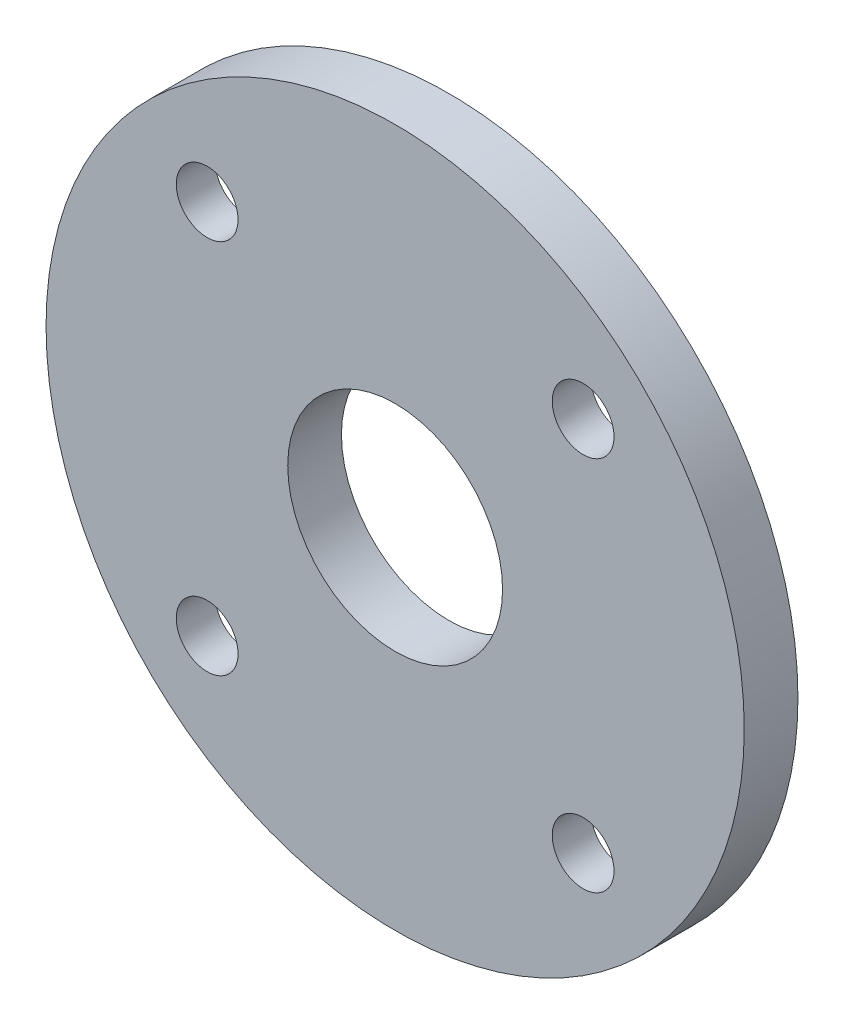
ISO-10303-21;
HEADER;
FILE_DESCRIPTION(('STEP AP214'),'2;1');
FILE_NAME('part.step','',(''),(''),'','','');
FILE_SCHEMA(('AUTOMOTIVE_DESIGN { 1 0 10303 214 1 1 1 1 }'));
ENDSEC;
DATA;
#1=APPLICATION_CONTEXT('core data for automotive mechanical design processes');
#2=APPLICATION_PROTOCOL_DEFINITION('international standard','automotive_design',2000,#1);
#3=PRODUCT_CONTEXT('',#1,'mechanical');
#4=PRODUCT('Part','Part','',(#3));
#5=PRODUCT_RELATED_PRODUCT_CATEGORY('part','',(#4));
#6=PRODUCT_DEFINITION_FORMATION('','',#4);
#7=PRODUCT_DEFINITION_CONTEXT('part definition',#1,'design');
#8=PRODUCT_DEFINITION('design','',#6,#7);
#9=PRODUCT_DEFINITION_SHAPE('','',#8);
#10=(LENGTH_UNIT() NAMED_UNIT(*) SI_UNIT(.MILLI.,.METRE.));
#11=(NAMED_UNIT(*) PLANE_ANGLE_UNIT() SI_UNIT($,.RADIAN.));
#12=(NAMED_UNIT(*) SI_UNIT($,.STERADIAN.) SOLID_ANGLE_UNIT());
#13=UNCERTAINTY_MEASURE_WITH_UNIT(LENGTH_MEASURE(1.E-05),#10,'distance_accuracy_value','');
#14=(GEOMETRIC_REPRESENTATION_CONTEXT(3) GLOBAL_UNCERTAINTY_ASSIGNED_CONTEXT((#13)) GLOBAL_UNIT_ASSIGNED_CONTEXT((#10,
#11,#12)) REPRESENTATION_CONTEXT('',''));
#15=CARTESIAN_POINT('',(0.,0.,0.));
#16=DIRECTION('',(0.,0.,1.));
#17=DIRECTION('',(1.,0.,0.));
#18=AXIS2_PLACEMENT_3D('',#15,#16,#17);
#19=CARTESIAN_POINT('',(0.,0.,2.));
#20=DIRECTION('',(0.,0.,1.));
#21=DIRECTION('',(1.,0.,0.));
#22=AXIS2_PLACEMENT_3D('',#19,#20,#21);
#23=PLANE('',#22);
#24=CARTESIAN_POINT('',(7.,-7.,2.));
#25=DIRECTION('',(0.,0.,1.));
#26=DIRECTION('',(1.,0.,0.));
#27=AXIS2_PLACEMENT_3D('',#24,#25,#26);
#28=CIRCLE('',#27,1.15);
#29=CARTESIAN_POINT('',(8.15,-7.,2.));
#30=VERTEX_POINT('',#29);
#31=EDGE_CURVE('E72',#30,#30,#28,.T.);
#32=ORIENTED_EDGE('',*,*,#31,.F.);
#33=EDGE_LOOP('',(#32));
#34=FACE_BOUND('',#33,.T.);
#35=CARTESIAN_POINT('',(-7.,-7.,2.));
#36=DIRECTION('',(0.,0.,1.));
#37=DIRECTION('',(1.,0.,0.));
#38=AXIS2_PLACEMENT_3D('',#35,#36,#37);
#39=CIRCLE('',#38,1.15);
#40=CARTESIAN_POINT('',(-5.85,-7.,2.));
#41=VERTEX_POINT('',#40);
#42=EDGE_CURVE('E73',#41,#41,#39,.T.);
#43=ORIENTED_EDGE('',*,*,#42,.F.);
#44=EDGE_LOOP('',(#43));
#45=FACE_BOUND('',#44,.T.);
#46=CARTESIAN_POINT('',(-7.,7.,2.));
#47=DIRECTION('',(0.,0.,1.));
#48=DIRECTION('',(1.,0.,0.));
#49=AXIS2_PLACEMENT_3D('',#46,#47,#48);
#50=CIRCLE('',#49,1.15);
#51=CARTESIAN_POINT('',(-5.85,7.,2.));
#52=VERTEX_POINT('',#51);
#53=EDGE_CURVE('E78',#52,#52,#50,.T.);
#54=ORIENTED_EDGE('',*,*,#53,.F.);
#55=EDGE_LOOP('',(#54));
#56=FACE_BOUND('',#55,.T.);
#57=CARTESIAN_POINT('',(7.,7.,2.));
#58=DIRECTION('',(0.,0.,1.));
#59=DIRECTION('',(1.,0.,0.));
#60=AXIS2_PLACEMENT_3D('',#57,#58,#59);
#61=CIRCLE('',#60,1.15);
#62=CARTESIAN_POINT('',(8.15,7.,2.));
#63=VERTEX_POINT('',#62);
#64=EDGE_CURVE('E83',#63,#63,#61,.T.);
#65=ORIENTED_EDGE('',*,*,#64,.F.);
#66=EDGE_LOOP('',(#65));
#67=FACE_BOUND('',#66,.T.);
#68=CARTESIAN_POINT('',(0.,0.,2.));
#69=DIRECTION('',(0.,0.,1.));
#70=DIRECTION('',(1.,0.,0.));
#71=AXIS2_PLACEMENT_3D('',#68,#69,#70);
#72=CIRCLE('',#71,13.);
#73=CARTESIAN_POINT('',(13.,0.,2.));
#74=VERTEX_POINT('',#73);
#75=EDGE_CURVE('E10',#74,#74,#72,.T.);
#76=ORIENTED_EDGE('',*,*,#75,.T.);
#77=EDGE_LOOP('',(#76));
#78=FACE_BOUND('',#77,.T.);
#79=CARTESIAN_POINT('',(0.,0.,2.));
#80=DIRECTION('',(0.,0.,1.));
#81=DIRECTION('',(1.,0.,0.));
#82=AXIS2_PLACEMENT_3D('',#79,#80,#81);
#83=CIRCLE('',#82,4.);
#84=CARTESIAN_POINT('',(4.,0.,2.));
#85=VERTEX_POINT('',#84);
#86=EDGE_CURVE('E53',#85,#85,#83,.T.);
#87=ORIENTED_EDGE('',*,*,#86,.F.);
#88=EDGE_LOOP('',(#87));
#89=FACE_BOUND('',#88,.T.);
#90=ADVANCED_FACE('F41',(#34,#45,#56,#67,#78,#89),#23,.T.);
#91=CARTESIAN_POINT('',(0.,0.,0.));
#92=DIRECTION('',(0.,0.,1.));
#93=DIRECTION('',(1.,0.,0.));
#94=AXIS2_PLACEMENT_3D('',#91,#92,#93);
#95=PLANE('',#94);
#96=CARTESIAN_POINT('',(7.,-7.,0.));
#97=DIRECTION('',(0.,0.,1.));
#98=DIRECTION('',(1.,0.,0.));
#99=AXIS2_PLACEMENT_3D('',#96,#97,#98);
#100=CIRCLE('',#99,2.1);
#101=CARTESIAN_POINT('',(9.1,-7.,0.));
#102=VERTEX_POINT('',#101);
#103=EDGE_CURVE('E134',#102,#102,#100,.T.);
#104=ORIENTED_EDGE('',*,*,#103,.T.);
#105=EDGE_LOOP('',(#104));
#106=FACE_BOUND('',#105,.T.);
#107=CARTESIAN_POINT('',(-7.,-7.,0.));
#108=DIRECTION('',(0.,0.,1.));
#109=DIRECTION('',(1.,0.,0.));
#110=AXIS2_PLACEMENT_3D('',#107,#108,#109);
#111=CIRCLE('',#110,2.1);
#112=CARTESIAN_POINT('',(-4.9,-7.,0.));
#113=VERTEX_POINT('',#112);
#114=EDGE_CURVE('E138',#113,#113,#111,.T.);
#115=ORIENTED_EDGE('',*,*,#114,.T.);
#116=EDGE_LOOP('',(#115));
#117=FACE_BOUND('',#116,.T.);
#118=CARTESIAN_POINT('',(-7.,7.,0.));
#119=DIRECTION('',(0.,0.,1.));
#120=DIRECTION('',(1.,0.,0.));
#121=AXIS2_PLACEMENT_3D('',#118,#119,#120);
#122=CIRCLE('',#121,2.1);
#123=CARTESIAN_POINT('',(-4.9,7.,0.));
#124=VERTEX_POINT('',#123);
#125=EDGE_CURVE('E130',#124,#124,#122,.T.);
#126=ORIENTED_EDGE('',*,*,#125,.T.);
#127=EDGE_LOOP('',(#126));
#128=FACE_BOUND('',#127,.T.);
#129=CARTESIAN_POINT('',(7.,7.,0.));
#130=DIRECTION('',(0.,0.,1.));
#131=DIRECTION('',(1.,0.,0.));
#132=AXIS2_PLACEMENT_3D('',#129,#130,#131);
#133=CIRCLE('',#132,2.1);
#134=CARTESIAN_POINT('',(9.1,7.,0.));
#135=VERTEX_POINT('',#134);
#136=EDGE_CURVE('E123',#135,#135,#133,.T.);
#137=ORIENTED_EDGE('',*,*,#136,.T.);
#138=EDGE_LOOP('',(#137));
#139=FACE_BOUND('',#138,.T.);
#140=CARTESIAN_POINT('',(0.,0.,0.));
#141=DIRECTION('',(0.,0.,1.));
#142=DIRECTION('',(1.,0.,0.));
#143=AXIS2_PLACEMENT_3D('',#140,#141,#142);
#144=CIRCLE('',#143,13.);
#145=CARTESIAN_POINT('',(13.,0.,0.));
#146=VERTEX_POINT('',#145);
#147=EDGE_CURVE('E47',#146,#146,#144,.T.);
#148=ORIENTED_EDGE('',*,*,#147,.F.);
#149=EDGE_LOOP('',(#148));
#150=FACE_BOUND('',#149,.T.);
#151=CARTESIAN_POINT('',(0.,0.,0.));
#152=DIRECTION('',(0.,0.,1.));
#153=DIRECTION('',(1.,0.,0.));
#154=AXIS2_PLACEMENT_3D('',#151,#152,#153);
#155=CIRCLE('',#154,4.);
#156=CARTESIAN_POINT('',(4.,0.,0.));
#157=VERTEX_POINT('',#156);
#158=EDGE_CURVE('E60',#157,#157,#155,.T.);
#159=ORIENTED_EDGE('',*,*,#158,.T.);
#160=EDGE_LOOP('',(#159));
#161=FACE_BOUND('',#160,.T.);
#162=ADVANCED_FACE('F95',(#106,#117,#128,#139,#150,#161),#95,.F.);
#163=CARTESIAN_POINT('',(0.,0.,2.));
#164=DIRECTION('',(0.,0.,-1.));
#165=DIRECTION('',(-1.,0.,0.));
#166=AXIS2_PLACEMENT_3D('',#163,#164,#165);
#167=CYLINDRICAL_SURFACE('',#166,13.);
#168=ORIENTED_EDGE('',*,*,#75,.F.);
#169=EDGE_LOOP('',(#168));
#170=FACE_BOUND('',#169,.T.);
#171=ORIENTED_EDGE('',*,*,#147,.T.);
#172=EDGE_LOOP('',(#171));
#173=FACE_BOUND('',#172,.T.);
#174=ADVANCED_FACE('F43',(#170,#173),#167,.T.);
#175=CARTESIAN_POINT('',(0.,0.,2.));
#176=DIRECTION('',(0.,0.,-1.));
#177=DIRECTION('',(-1.,0.,0.));
#178=AXIS2_PLACEMENT_3D('',#175,#176,#177);
#179=CYLINDRICAL_SURFACE('',#178,4.);
#180=ORIENTED_EDGE('',*,*,#86,.T.);
#181=EDGE_LOOP('',(#180));
#182=FACE_BOUND('',#181,.T.);
#183=ORIENTED_EDGE('',*,*,#158,.F.);
#184=EDGE_LOOP('',(#183));
#185=FACE_BOUND('',#184,.T.);
#186=ADVANCED_FACE('F94',(#182,#185),#179,.F.);
#187=CARTESIAN_POINT('',(7.,7.,2.));
#188=DIRECTION('',(0.,0.,-1.));
#189=DIRECTION('',(-1.,0.,0.));
#190=AXIS2_PLACEMENT_3D('',#187,#188,#189);
#191=CYLINDRICAL_SURFACE('',#190,1.15);
#192=CARTESIAN_POINT('',(7.,7.,0.55));
#193=DIRECTION('',(0.,0.,1.));
#194=DIRECTION('',(1.,0.,0.));
#195=AXIS2_PLACEMENT_3D('',#192,#193,#194);
#196=CIRCLE('',#195,1.15);
#197=CARTESIAN_POINT('',(8.15,7.,0.55));
#198=VERTEX_POINT('',#197);
#199=EDGE_CURVE('E44',#198,#198,#196,.T.);
#200=ORIENTED_EDGE('',*,*,#199,.F.);
#201=EDGE_LOOP('',(#200));
#202=FACE_BOUND('',#201,.T.);
#203=ORIENTED_EDGE('',*,*,#64,.T.);
#204=EDGE_LOOP('',(#203));
#205=FACE_BOUND('',#204,.T.);
#206=ADVANCED_FACE('F96',(#202,#205),#191,.F.);
#207=CARTESIAN_POINT('',(-7.,7.,2.));
#208=DIRECTION('',(0.,0.,-1.));
#209=DIRECTION('',(-1.,0.,0.));
#210=AXIS2_PLACEMENT_3D('',#207,#208,#209);
#211=CYLINDRICAL_SURFACE('',#210,1.15);
#212=CARTESIAN_POINT('',(-7.,7.,0.55));
#213=DIRECTION('',(0.,0.,1.));
#214=DIRECTION('',(1.,0.,0.));
#215=AXIS2_PLACEMENT_3D('',#212,#213,#214);
#216=CIRCLE('',#215,1.15);
#217=CARTESIAN_POINT('',(-5.85,7.,0.55));
#218=VERTEX_POINT('',#217);
#219=EDGE_CURVE('E66',#218,#218,#216,.T.);
#220=ORIENTED_EDGE('',*,*,#219,.F.);
#221=EDGE_LOOP('',(#220));
#222=FACE_BOUND('',#221,.T.);
#223=ORIENTED_EDGE('',*,*,#53,.T.);
#224=EDGE_LOOP('',(#223));
#225=FACE_BOUND('',#224,.T.);
#226=ADVANCED_FACE('F103',(#222,#225),#211,.F.);
#227=CARTESIAN_POINT('',(-7.,-7.,2.));
#228=DIRECTION('',(0.,0.,-1.));
#229=DIRECTION('',(-1.,0.,0.));
#230=AXIS2_PLACEMENT_3D('',#227,#228,#229);
#231=CYLINDRICAL_SURFACE('',#230,1.15);
#232=CARTESIAN_POINT('',(-7.,-7.,0.55));
#233=DIRECTION('',(0.,0.,1.));
#234=DIRECTION('',(1.,0.,0.));
#235=AXIS2_PLACEMENT_3D('',#232,#233,#234);
#236=CIRCLE('',#235,1.15);
#237=CARTESIAN_POINT('',(-5.85,-7.,0.55));
#238=VERTEX_POINT('',#237);
#239=EDGE_CURVE('E64',#238,#238,#236,.T.);
#240=ORIENTED_EDGE('',*,*,#239,.F.);
#241=EDGE_LOOP('',(#240));
#242=FACE_BOUND('',#241,.T.);
#243=ORIENTED_EDGE('',*,*,#42,.T.);
#244=EDGE_LOOP('',(#243));
#245=FACE_BOUND('',#244,.T.);
#246=ADVANCED_FACE('F187',(#242,#245),#231,.F.);
#247=CARTESIAN_POINT('',(7.,-7.,2.));
#248=DIRECTION('',(0.,0.,-1.));
#249=DIRECTION('',(-1.,0.,0.));
#250=AXIS2_PLACEMENT_3D('',#247,#248,#249);
#251=CYLINDRICAL_SURFACE('',#250,1.15);
#252=CARTESIAN_POINT('',(7.,-7.,0.55));
#253=DIRECTION('',(0.,0.,1.));
#254=DIRECTION('',(1.,0.,0.));
#255=AXIS2_PLACEMENT_3D('',#252,#253,#254);
#256=CIRCLE('',#255,1.15);
#257=CARTESIAN_POINT('',(8.15,-7.,0.55));
#258=VERTEX_POINT('',#257);
#259=EDGE_CURVE('E58',#258,#258,#256,.T.);
#260=ORIENTED_EDGE('',*,*,#259,.F.);
#261=EDGE_LOOP('',(#260));
#262=FACE_BOUND('',#261,.T.);
#263=ORIENTED_EDGE('',*,*,#31,.T.);
#264=EDGE_LOOP('',(#263));
#265=FACE_BOUND('',#264,.T.);
#266=ADVANCED_FACE('F174',(#262,#265),#251,.F.);
#267=CARTESIAN_POINT('',(7.,-7.,0.55));
#268=DIRECTION('',(0.,0.,-1.));
#269=DIRECTION('',(-1.,0.,0.));
#270=AXIS2_PLACEMENT_3D('',#267,#268,#269);
#271=CYLINDRICAL_SURFACE('',#270,2.1);
#272=CARTESIAN_POINT('',(7.,-7.,0.55));
#273=DIRECTION('',(0.,0.,1.));
#274=DIRECTION('',(1.,0.,0.));
#275=AXIS2_PLACEMENT_3D('',#272,#273,#274);
#276=CIRCLE('',#275,2.1);
#277=CARTESIAN_POINT('',(9.1,-7.,0.55));
#278=VERTEX_POINT('',#277);
#279=EDGE_CURVE('E128',#278,#278,#276,.T.);
#280=ORIENTED_EDGE('',*,*,#279,.T.);
#281=EDGE_LOOP('',(#280));
#282=FACE_BOUND('',#281,.T.);
#283=ORIENTED_EDGE('',*,*,#103,.F.);
#284=EDGE_LOOP('',(#283));
#285=FACE_BOUND('',#284,.T.);
#286=ADVANCED_FACE('F168',(#282,#285),#271,.F.);
#287=CARTESIAN_POINT('',(7.,-7.,0.55));
#288=DIRECTION('',(0.,0.,1.));
#289=DIRECTION('',(1.,0.,0.));
#290=AXIS2_PLACEMENT_3D('',#287,#288,#289);
#291=PLANE('',#290);
#292=ORIENTED_EDGE('',*,*,#259,.T.);
#293=EDGE_LOOP('',(#292));
#294=FACE_BOUND('',#293,.T.);
#295=ORIENTED_EDGE('',*,*,#279,.F.);
#296=EDGE_LOOP('',(#295));
#297=FACE_BOUND('',#296,.T.);
#298=ADVANCED_FACE('F170',(#294,#297),#291,.F.);
#299=CARTESIAN_POINT('',(-7.,-7.,0.55));
#300=DIRECTION('',(0.,0.,-1.));
#301=DIRECTION('',(-1.,0.,0.));
#302=AXIS2_PLACEMENT_3D('',#299,#300,#301);
#303=CYLINDRICAL_SURFACE('',#302,2.1);
#304=CARTESIAN_POINT('',(-7.,-7.,0.55));
#305=DIRECTION('',(0.,0.,1.));
#306=DIRECTION('',(1.,0.,0.));
#307=AXIS2_PLACEMENT_3D('',#304,#305,#306);
#308=CIRCLE('',#307,2.1);
#309=CARTESIAN_POINT('',(-4.9,-7.,0.55));
#310=VERTEX_POINT('',#309);
#311=EDGE_CURVE('E136',#310,#310,#308,.T.);
#312=ORIENTED_EDGE('',*,*,#311,.T.);
#313=EDGE_LOOP('',(#312));
#314=FACE_BOUND('',#313,.T.);
#315=ORIENTED_EDGE('',*,*,#114,.F.);
#316=EDGE_LOOP('',(#315));
#317=FACE_BOUND('',#316,.T.);
#318=ADVANCED_FACE('F165',(#314,#317),#303,.F.);
#319=CARTESIAN_POINT('',(-7.,-7.,0.55));
#320=DIRECTION('',(0.,0.,1.));
#321=DIRECTION('',(1.,0.,0.));
#322=AXIS2_PLACEMENT_3D('',#319,#320,#321);
#323=PLANE('',#322);
#324=ORIENTED_EDGE('',*,*,#239,.T.);
#325=EDGE_LOOP('',(#324));
#326=FACE_BOUND('',#325,.T.);
#327=ORIENTED_EDGE('',*,*,#311,.F.);
#328=EDGE_LOOP('',(#327));
#329=FACE_BOUND('',#328,.T.);
#330=ADVANCED_FACE('F153',(#326,#329),#323,.F.);
#331=CARTESIAN_POINT('',(-7.,7.,0.55));
#332=DIRECTION('',(0.,0.,-1.));
#333=DIRECTION('',(-1.,0.,0.));
#334=AXIS2_PLACEMENT_3D('',#331,#332,#333);
#335=CYLINDRICAL_SURFACE('',#334,2.1);
#336=CARTESIAN_POINT('',(-7.,7.,0.55));
#337=DIRECTION('',(0.,0.,1.));
#338=DIRECTION('',(1.,0.,0.));
#339=AXIS2_PLACEMENT_3D('',#336,#337,#338);
#340=CIRCLE('',#339,2.1);
#341=CARTESIAN_POINT('',(-4.9,7.,0.55));
#342=VERTEX_POINT('',#341);
#343=EDGE_CURVE('E142',#342,#342,#340,.T.);
#344=ORIENTED_EDGE('',*,*,#343,.T.);
#345=EDGE_LOOP('',(#344));
#346=FACE_BOUND('',#345,.T.);
#347=ORIENTED_EDGE('',*,*,#125,.F.);
#348=EDGE_LOOP('',(#347));
#349=FACE_BOUND('',#348,.T.);
#350=ADVANCED_FACE('F147',(#346,#349),#335,.F.);
#351=CARTESIAN_POINT('',(-7.,7.,0.55));
#352=DIRECTION('',(0.,0.,1.));
#353=DIRECTION('',(1.,0.,0.));
#354=AXIS2_PLACEMENT_3D('',#351,#352,#353);
#355=PLANE('',#354);
#356=ORIENTED_EDGE('',*,*,#219,.T.);
#357=EDGE_LOOP('',(#356));
#358=FACE_BOUND('',#357,.T.);
#359=ORIENTED_EDGE('',*,*,#343,.F.);
#360=EDGE_LOOP('',(#359));
#361=FACE_BOUND('',#360,.T.);
#362=ADVANCED_FACE('F155',(#358,#361),#355,.F.);
#363=CARTESIAN_POINT('',(7.,7.,0.55));
#364=DIRECTION('',(0.,0.,-1.));
#365=DIRECTION('',(-1.,0.,0.));
#366=AXIS2_PLACEMENT_3D('',#363,#364,#365);
#367=CYLINDRICAL_SURFACE('',#366,2.1);
#368=CARTESIAN_POINT('',(7.,7.,0.55));
#369=DIRECTION('',(0.,0.,1.));
#370=DIRECTION('',(1.,0.,0.));
#371=AXIS2_PLACEMENT_3D('',#368,#369,#370);
#372=CIRCLE('',#371,2.1);
#373=CARTESIAN_POINT('',(9.1,7.,0.55));
#374=VERTEX_POINT('',#373);
#375=EDGE_CURVE('E61',#374,#374,#372,.T.);
#376=ORIENTED_EDGE('',*,*,#375,.T.);
#377=EDGE_LOOP('',(#376));
#378=FACE_BOUND('',#377,.T.);
#379=ORIENTED_EDGE('',*,*,#136,.F.);
#380=EDGE_LOOP('',(#379));
#381=FACE_BOUND('',#380,.T.);
#382=ADVANCED_FACE('F159',(#378,#381),#367,.F.);
#383=CARTESIAN_POINT('',(7.,7.,0.55));
#384=DIRECTION('',(0.,0.,1.));
#385=DIRECTION('',(1.,0.,0.));
#386=AXIS2_PLACEMENT_3D('',#383,#384,#385);
#387=PLANE('',#386);
#388=ORIENTED_EDGE('',*,*,#199,.T.);
#389=EDGE_LOOP('',(#388));
#390=FACE_BOUND('',#389,.T.);
#391=ORIENTED_EDGE('',*,*,#375,.F.);
#392=EDGE_LOOP('',(#391));
#393=FACE_BOUND('',#392,.T.);
#394=ADVANCED_FACE('F177',(#390,#393),#387,.F.);
#395=CLOSED_SHELL('',(#90,#162,#174,#186,#206,#226,#246,#266,#286,#298,#318,#330,#350,#362,#382,#394));
#396=MANIFOLD_SOLID_BREP('B2',#395);
#397=ADVANCED_BREP_SHAPE_REPRESENTATION('',(#18,#396),#14);
#398=SHAPE_DEFINITION_REPRESENTATION(#9,#397);
ENDSEC;
END-ISO-10303-21;
